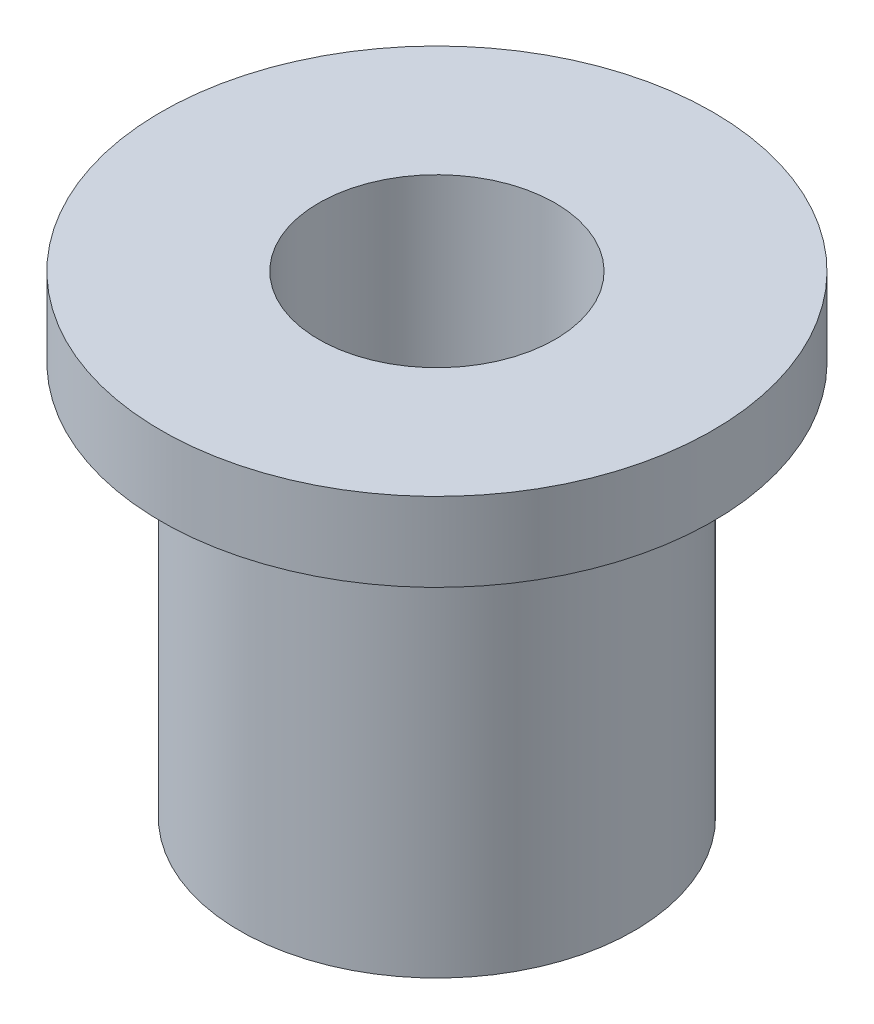
ISO-10303-21;
HEADER;
FILE_DESCRIPTION(('STEP AP214'),'2;1');
FILE_NAME('part.step','',(''),(''),'','','');
FILE_SCHEMA(('AUTOMOTIVE_DESIGN { 1 0 10303 214 1 1 1 1 }'));
ENDSEC;
DATA;
#1=APPLICATION_CONTEXT('core data for automotive mechanical design processes');
#2=APPLICATION_PROTOCOL_DEFINITION('international standard','automotive_design',2000,#1);
#3=PRODUCT_CONTEXT('',#1,'mechanical');
#4=PRODUCT('Part','Part','',(#3));
#5=PRODUCT_RELATED_PRODUCT_CATEGORY('part','',(#4));
#6=PRODUCT_DEFINITION_FORMATION('','',#4);
#7=PRODUCT_DEFINITION_CONTEXT('part definition',#1,'design');
#8=PRODUCT_DEFINITION('design','',#6,#7);
#9=PRODUCT_DEFINITION_SHAPE('','',#8);
#10=(LENGTH_UNIT() NAMED_UNIT(*) SI_UNIT(.MILLI.,.METRE.));
#11=(NAMED_UNIT(*) PLANE_ANGLE_UNIT() SI_UNIT($,.RADIAN.));
#12=(NAMED_UNIT(*) SI_UNIT($,.STERADIAN.) SOLID_ANGLE_UNIT());
#13=UNCERTAINTY_MEASURE_WITH_UNIT(LENGTH_MEASURE(1.E-05),#10,'distance_accuracy_value','');
#14=(GEOMETRIC_REPRESENTATION_CONTEXT(3) GLOBAL_UNCERTAINTY_ASSIGNED_CONTEXT((#13)) GLOBAL_UNIT_ASSIGNED_CONTEXT((#10,
#11,#12)) REPRESENTATION_CONTEXT('',''));
#15=CARTESIAN_POINT('',(0.,0.,0.));
#16=DIRECTION('',(0.,0.,1.));
#17=DIRECTION('',(1.,0.,0.));
#18=AXIS2_PLACEMENT_3D('',#15,#16,#17);
#19=CARTESIAN_POINT('',(0.,0.,0.));
#20=DIRECTION('',(0.,-1.,0.));
#21=DIRECTION('',(0.,0.,-1.));
#22=AXIS2_PLACEMENT_3D('',#19,#20,#21);
#23=CYLINDRICAL_SURFACE('',#22,4.5);
#24=CARTESIAN_POINT('',(0.,0.,0.));
#25=DIRECTION('',(0.,-1.,0.));
#26=DIRECTION('',(0.,0.,-1.));
#27=AXIS2_PLACEMENT_3D('',#24,#25,#26);
#28=CIRCLE('',#27,4.5);
#29=CARTESIAN_POINT('',(0.,0.,-4.5));
#30=VERTEX_POINT('',#29);
#31=EDGE_CURVE('E10',#30,#30,#28,.T.);
#32=ORIENTED_EDGE('',*,*,#31,.T.);
#33=EDGE_LOOP('',(#32));
#34=FACE_BOUND('',#33,.T.);
#35=CARTESIAN_POINT('',(0.,18.,0.));
#36=DIRECTION('',(0.,-1.,0.));
#37=DIRECTION('',(0.,0.,-1.));
#38=AXIS2_PLACEMENT_3D('',#35,#36,#37);
#39=CIRCLE('',#38,4.5);
#40=CARTESIAN_POINT('',(0.,18.,-4.5));
#41=VERTEX_POINT('',#40);
#42=EDGE_CURVE('E52',#41,#41,#39,.T.);
#43=ORIENTED_EDGE('',*,*,#42,.F.);
#44=EDGE_LOOP('',(#43));
#45=FACE_BOUND('',#44,.T.);
#46=ADVANCED_FACE('F30',(#34,#45),#23,.F.);
#47=CARTESIAN_POINT('',(4.5,0.,0.));
#48=DIRECTION('',(0.,-1.,0.));
#49=DIRECTION('',(0.,0.,-1.));
#50=AXIS2_PLACEMENT_3D('',#47,#48,#49);
#51=PLANE('',#50);
#52=CARTESIAN_POINT('',(0.,0.,0.));
#53=DIRECTION('',(0.,-1.,0.));
#54=DIRECTION('',(0.,0.,-1.));
#55=AXIS2_PLACEMENT_3D('',#52,#53,#54);
#56=CIRCLE('',#55,7.5);
#57=CARTESIAN_POINT('',(0.,0.,-7.5));
#58=VERTEX_POINT('',#57);
#59=EDGE_CURVE('E36',#58,#58,#56,.T.);
#60=ORIENTED_EDGE('',*,*,#59,.T.);
#61=EDGE_LOOP('',(#60));
#62=FACE_BOUND('',#61,.T.);
#63=ORIENTED_EDGE('',*,*,#31,.F.);
#64=EDGE_LOOP('',(#63));
#65=FACE_BOUND('',#64,.T.);
#66=ADVANCED_FACE('F60',(#62,#65),#51,.T.);
#67=CARTESIAN_POINT('',(0.,0.,0.));
#68=DIRECTION('',(0.,-1.,0.));
#69=DIRECTION('',(0.,0.,-1.));
#70=AXIS2_PLACEMENT_3D('',#67,#68,#69);
#71=CYLINDRICAL_SURFACE('',#70,7.5);
#72=CARTESIAN_POINT('',(0.,15.,0.));
#73=DIRECTION('',(0.,-1.,0.));
#74=DIRECTION('',(0.,0.,-1.));
#75=AXIS2_PLACEMENT_3D('',#72,#73,#74);
#76=CIRCLE('',#75,7.5);
#77=CARTESIAN_POINT('',(0.,15.,-7.5));
#78=VERTEX_POINT('',#77);
#79=EDGE_CURVE('E40',#78,#78,#76,.T.);
#80=ORIENTED_EDGE('',*,*,#79,.T.);
#81=EDGE_LOOP('',(#80));
#82=FACE_BOUND('',#81,.T.);
#83=ORIENTED_EDGE('',*,*,#59,.F.);
#84=EDGE_LOOP('',(#83));
#85=FACE_BOUND('',#84,.T.);
#86=ADVANCED_FACE('F64',(#82,#85),#71,.T.);
#87=CARTESIAN_POINT('',(7.5,15.,0.));
#88=DIRECTION('',(0.,-1.,0.));
#89=DIRECTION('',(0.,0.,-1.));
#90=AXIS2_PLACEMENT_3D('',#87,#88,#89);
#91=PLANE('',#90);
#92=CARTESIAN_POINT('',(0.,15.,0.));
#93=DIRECTION('',(0.,-1.,0.));
#94=DIRECTION('',(0.,0.,-1.));
#95=AXIS2_PLACEMENT_3D('',#92,#93,#94);
#96=CIRCLE('',#95,10.5);
#97=CARTESIAN_POINT('',(0.,15.,-10.5));
#98=VERTEX_POINT('',#97);
#99=EDGE_CURVE('E44',#98,#98,#96,.T.);
#100=ORIENTED_EDGE('',*,*,#99,.T.);
#101=EDGE_LOOP('',(#100));
#102=FACE_BOUND('',#101,.T.);
#103=ORIENTED_EDGE('',*,*,#79,.F.);
#104=EDGE_LOOP('',(#103));
#105=FACE_BOUND('',#104,.T.);
#106=ADVANCED_FACE('F68',(#102,#105),#91,.T.);
#107=CARTESIAN_POINT('',(0.,0.,0.));
#108=DIRECTION('',(0.,-1.,0.));
#109=DIRECTION('',(0.,0.,-1.));
#110=AXIS2_PLACEMENT_3D('',#107,#108,#109);
#111=CYLINDRICAL_SURFACE('',#110,10.5);
#112=CARTESIAN_POINT('',(0.,18.,0.));
#113=DIRECTION('',(0.,-1.,0.));
#114=DIRECTION('',(0.,0.,-1.));
#115=AXIS2_PLACEMENT_3D('',#112,#113,#114);
#116=CIRCLE('',#115,10.5);
#117=CARTESIAN_POINT('',(0.,18.,-10.5));
#118=VERTEX_POINT('',#117);
#119=EDGE_CURVE('E49',#118,#118,#116,.T.);
#120=ORIENTED_EDGE('',*,*,#119,.T.);
#121=EDGE_LOOP('',(#120));
#122=FACE_BOUND('',#121,.T.);
#123=ORIENTED_EDGE('',*,*,#99,.F.);
#124=EDGE_LOOP('',(#123));
#125=FACE_BOUND('',#124,.T.);
#126=ADVANCED_FACE('F75',(#122,#125),#111,.T.);
#127=CARTESIAN_POINT('',(10.5,18.,0.));
#128=DIRECTION('',(0.,1.,0.));
#129=DIRECTION('',(0.,0.,1.));
#130=AXIS2_PLACEMENT_3D('',#127,#128,#129);
#131=PLANE('',#130);
#132=ORIENTED_EDGE('',*,*,#42,.T.);
#133=EDGE_LOOP('',(#132));
#134=FACE_BOUND('',#133,.T.);
#135=ORIENTED_EDGE('',*,*,#119,.F.);
#136=EDGE_LOOP('',(#135));
#137=FACE_BOUND('',#136,.T.);
#138=ADVANCED_FACE('F56',(#134,#137),#131,.T.);
#139=CLOSED_SHELL('',(#46,#66,#86,#106,#126,#138));
#140=MANIFOLD_SOLID_BREP('B2',#139);
#141=ADVANCED_BREP_SHAPE_REPRESENTATION('',(#18,#140),#14);
#142=SHAPE_DEFINITION_REPRESENTATION(#9,#141);
ENDSEC;
END-ISO-10303-21;
